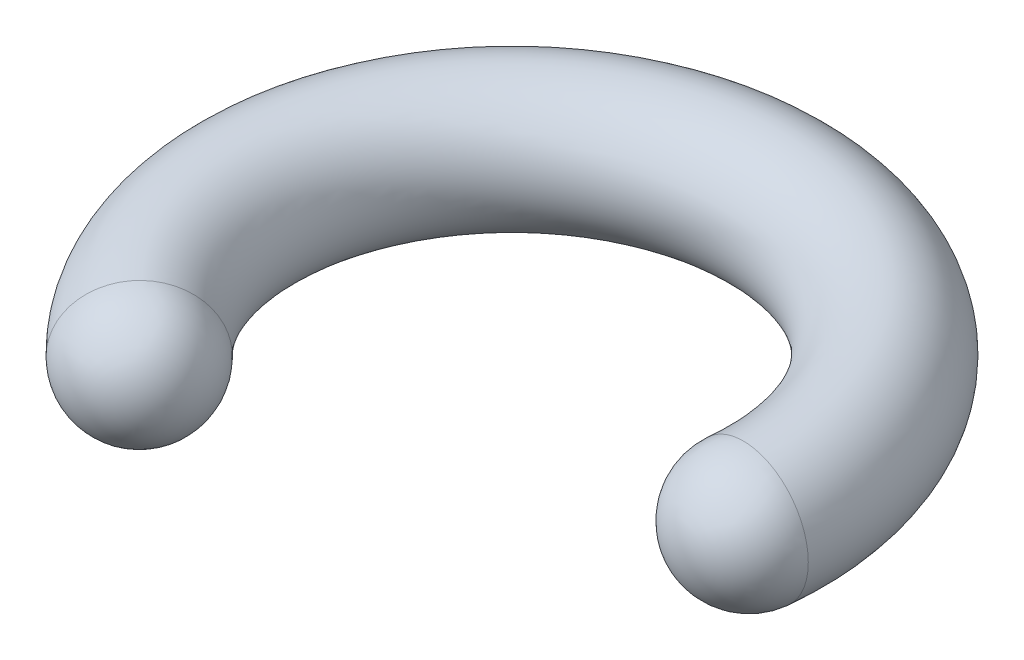
ISO-10303-21;
HEADER;
FILE_DESCRIPTION(('STEP AP214'),'2;1');
FILE_NAME('part.step','',(''),(''),'','','');
FILE_SCHEMA(('AUTOMOTIVE_DESIGN { 1 0 10303 214 1 1 1 1 }'));
ENDSEC;
DATA;
#1=APPLICATION_CONTEXT('core data for automotive mechanical design processes');
#2=APPLICATION_PROTOCOL_DEFINITION('international standard','automotive_design',2000,#1);
#3=PRODUCT_CONTEXT('',#1,'mechanical');
#4=PRODUCT('Part','Part','',(#3));
#5=PRODUCT_RELATED_PRODUCT_CATEGORY('part','',(#4));
#6=PRODUCT_DEFINITION_FORMATION('','',#4);
#7=PRODUCT_DEFINITION_CONTEXT('part definition',#1,'design');
#8=PRODUCT_DEFINITION('design','',#6,#7);
#9=PRODUCT_DEFINITION_SHAPE('','',#8);
#10=(LENGTH_UNIT() NAMED_UNIT(*) SI_UNIT(.MILLI.,.METRE.));
#11=(NAMED_UNIT(*) PLANE_ANGLE_UNIT() SI_UNIT($,.RADIAN.));
#12=(NAMED_UNIT(*) SI_UNIT($,.STERADIAN.) SOLID_ANGLE_UNIT());
#13=UNCERTAINTY_MEASURE_WITH_UNIT(LENGTH_MEASURE(1.E-05),#10,'distance_accuracy_value','');
#14=(GEOMETRIC_REPRESENTATION_CONTEXT(3) GLOBAL_UNCERTAINTY_ASSIGNED_CONTEXT((#13)) GLOBAL_UNIT_ASSIGNED_CONTEXT((#10,
#11,#12)) REPRESENTATION_CONTEXT('',''));
#15=CARTESIAN_POINT('',(0.,0.,0.));
#16=DIRECTION('',(0.,0.,1.));
#17=DIRECTION('',(1.,0.,0.));
#18=AXIS2_PLACEMENT_3D('',#15,#16,#17);
#19=CARTESIAN_POINT('',(12.6999999999999,0.,-21.9970452561248));
#20=DIRECTION('',(0.,-1.,0.));
#21=DIRECTION('',(-0.86602540378444,0.,-0.499999999999998));
#22=AXIS2_PLACEMENT_3D('',#19,#20,#21);
#23=TOROIDAL_SURFACE('',#22,25.4,6.35);
#24=CARTESIAN_POINT('',(-5.09598343823974,0.,-3.87349777043923));
#25=DIRECTION('',(-0.713525491562423,0.,-0.700629269222035));
#26=DIRECTION('',(-0.700629269222035,0.,0.713525491562423));
#27=AXIS2_PLACEMENT_3D('',#24,#25,#26);
#28=CIRCLE('',#27,6.35);
#29=CARTESIAN_POINT('',(-9.54497929779967,0.,0.657389100982151));
#30=VERTEX_POINT('',#29);
#31=EDGE_CURVE('E50',#30,#30,#28,.T.);
#32=CARTESIAN_POINT('',(37.9821059900651,0.,-19.5526400713996));
#33=DIRECTION('',(-0.0962364245954787,0.,0.995358503545873));
#34=DIRECTION('',(0.995358503545873,0.,0.0962364245954787));
#35=AXIS2_PLACEMENT_3D('',#32,#33,#34);
#36=CIRCLE('',#35,6.35);
#37=CARTESIAN_POINT('',(44.3026324875814,0.,-18.9415387752183));
#38=VERTEX_POINT('',#37);
#39=EDGE_CURVE('E10',#38,#38,#36,.F.);
#40=CARTESIAN_POINT('',(12.6999999999999,0.,-21.9970452561248));
#41=DIRECTION('',(0.,-1.,0.));
#42=DIRECTION('',(-0.86602540378444,0.,-0.499999999999998));
#43=AXIS2_PLACEMENT_3D('',#40,#41,#42);
#44=CIRCLE('',#43,31.75);
#45=EDGE_CURVE('',#30,#38,#44,.T.);
#46=ORIENTED_EDGE('',*,*,#31,.T.);
#47=ORIENTED_EDGE('',*,*,#39,.T.);
#48=ORIENTED_EDGE('',*,*,#45,.T.);
#49=ORIENTED_EDGE('',*,*,#45,.F.);
#50=EDGE_LOOP('',(#46,#48,#47,#49));
#51=FACE_BOUND('',#50,.T.);
#52=ADVANCED_FACE('F42',(#51),#23,.T.);
#53=CARTESIAN_POINT('',(37.9821059900651,0.,-19.5526400713996));
#54=DIRECTION('',(0.342020143325677,0.,-0.939692620785905));
#55=DIRECTION('',(-0.939692620785906,0.,-0.342020143325677));
#56=AXIS2_PLACEMENT_3D('',#53,#54,#55);
#57=SPHERICAL_SURFACE('',#56,6.35);
#58=CARTESIAN_POINT('',(37.9821059900651,0.,-19.5526400713996));
#59=DIRECTION('',(-0.0962364245954787,0.,0.995358503545873));
#60=DIRECTION('',(0.995358503545873,0.,0.0962364245954787));
#61=AXIS2_PLACEMENT_3D('',#58,#59,#60);
#62=SPHERICAL_SURFACE('',#61,6.35);
#63=ORIENTED_EDGE('',*,*,#39,.F.);
#64=EDGE_LOOP('',(#63));
#65=FACE_BOUND('',#64,.T.);
#66=ADVANCED_FACE('F59',(#65),#62,.T.);
#67=CARTESIAN_POINT('',(-5.09598343823974,0.,-3.87349777043923));
#68=DIRECTION('',(0.86602540378444,0.,0.499999999999998));
#69=DIRECTION('',(0.499999999999998,0.,-0.86602540378444));
#70=AXIS2_PLACEMENT_3D('',#67,#68,#69);
#71=SPHERICAL_SURFACE('',#70,6.35);
#72=CARTESIAN_POINT('',(-5.09598343823974,0.,-3.87349777043923));
#73=DIRECTION('',(-0.713525491562423,0.,-0.700629269222035));
#74=DIRECTION('',(-0.700629269222035,0.,0.713525491562423));
#75=AXIS2_PLACEMENT_3D('',#72,#73,#74);
#76=SPHERICAL_SURFACE('',#75,6.35);
#77=ORIENTED_EDGE('',*,*,#31,.F.);
#78=EDGE_LOOP('',(#77));
#79=FACE_BOUND('',#78,.T.);
#80=ADVANCED_FACE('F44',(#79),#76,.T.);
#81=CLOSED_SHELL('',(#52,#66,#80));
#82=MANIFOLD_SOLID_BREP('B2',#81);
#83=ADVANCED_BREP_SHAPE_REPRESENTATION('',(#18,#82),#14);
#84=SHAPE_DEFINITION_REPRESENTATION(#9,#83);
ENDSEC;
END-ISO-10303-21;
